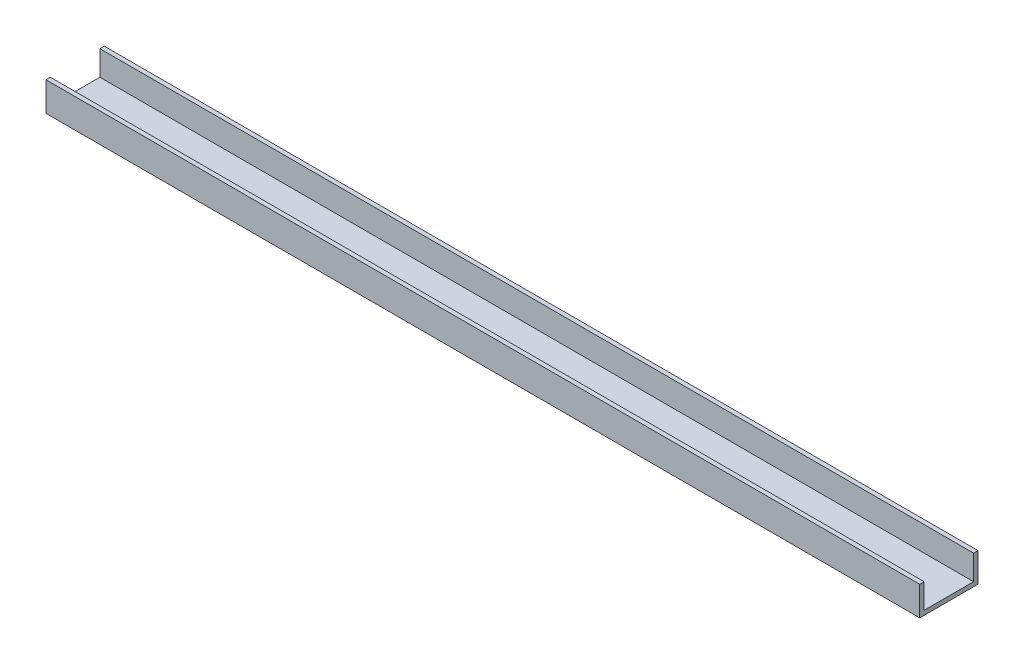
ISO-10303-21;
HEADER;
FILE_DESCRIPTION(('STEP AP214'),'2;1');
FILE_NAME('part.step','',(''),(''),'','','');
FILE_SCHEMA(('AUTOMOTIVE_DESIGN { 1 0 10303 214 1 1 1 1 }'));
ENDSEC;
DATA;
#1=APPLICATION_CONTEXT('core data for automotive mechanical design processes');
#2=APPLICATION_PROTOCOL_DEFINITION('international standard','automotive_design',2000,#1);
#3=PRODUCT_CONTEXT('',#1,'mechanical');
#4=PRODUCT('Part','Part','',(#3));
#5=PRODUCT_RELATED_PRODUCT_CATEGORY('part','',(#4));
#6=PRODUCT_DEFINITION_FORMATION('','',#4);
#7=PRODUCT_DEFINITION_CONTEXT('part definition',#1,'design');
#8=PRODUCT_DEFINITION('design','',#6,#7);
#9=PRODUCT_DEFINITION_SHAPE('','',#8);
#10=(LENGTH_UNIT() NAMED_UNIT(*) SI_UNIT(.MILLI.,.METRE.));
#11=(NAMED_UNIT(*) PLANE_ANGLE_UNIT() SI_UNIT($,.RADIAN.));
#12=(NAMED_UNIT(*) SI_UNIT($,.STERADIAN.) SOLID_ANGLE_UNIT());
#13=UNCERTAINTY_MEASURE_WITH_UNIT(LENGTH_MEASURE(1.E-05),#10,'distance_accuracy_value','');
#14=(GEOMETRIC_REPRESENTATION_CONTEXT(3) GLOBAL_UNCERTAINTY_ASSIGNED_CONTEXT((#13)) GLOBAL_UNIT_ASSIGNED_CONTEXT((#10,
#11,#12)) REPRESENTATION_CONTEXT('',''));
#15=CARTESIAN_POINT('',(0.,0.,0.));
#16=DIRECTION('',(0.,0.,1.));
#17=DIRECTION('',(1.,0.,0.));
#18=AXIS2_PLACEMENT_3D('',#15,#16,#17);
#19=CARTESIAN_POINT('',(300.,-6.42394817570351,-10.));
#20=DIRECTION('',(0.,0.,1.));
#21=DIRECTION('',(0.,-1.,0.));
#22=AXIS2_PLACEMENT_3D('',#19,#20,#21);
#23=PLANE('',#22);
#24=DIRECTION('',(0.,1.,0.));
#25=VECTOR('',#24,1.);
#26=CARTESIAN_POINT('',(0.,-6.42394817570351,-10.));
#27=LINE('',#26,#25);
#28=CARTESIAN_POINT('',(0.,-6.42394817570351,-10.));
#29=VERTEX_POINT('',#28);
#30=CARTESIAN_POINT('',(0.,3.57605182429649,-9.99999999999999));
#31=VERTEX_POINT('',#30);
#32=EDGE_CURVE('E129',#29,#31,#27,.T.);
#33=ORIENTED_EDGE('',*,*,#32,.T.);
#34=DIRECTION('',(-1.,0.,0.));
#35=VECTOR('',#34,1.);
#36=CARTESIAN_POINT('',(300.,3.57605182429649,-9.99999999999999));
#37=LINE('',#36,#35);
#38=CARTESIAN_POINT('',(300.,3.57605182429649,-9.99999999999999));
#39=VERTEX_POINT('',#38);
#40=EDGE_CURVE('E11',#39,#31,#37,.T.);
#41=ORIENTED_EDGE('',*,*,#40,.F.);
#42=DIRECTION('',(0.,1.,0.));
#43=VECTOR('',#42,1.);
#44=CARTESIAN_POINT('',(300.,-6.42394817570351,-10.));
#45=LINE('',#44,#43);
#46=CARTESIAN_POINT('',(300.,-6.42394817570351,-10.));
#47=VERTEX_POINT('',#46);
#48=EDGE_CURVE('E143',#47,#39,#45,.T.);
#49=ORIENTED_EDGE('',*,*,#48,.F.);
#50=DIRECTION('',(-1.,0.,0.));
#51=VECTOR('',#50,1.);
#52=CARTESIAN_POINT('',(300.,-6.42394817570351,-10.));
#53=LINE('',#52,#51);
#54=EDGE_CURVE('E125',#47,#29,#53,.T.);
#55=ORIENTED_EDGE('',*,*,#54,.T.);
#56=EDGE_LOOP('',(#33,#41,#49,#55));
#57=FACE_BOUND('',#56,.T.);
#58=ADVANCED_FACE('F33',(#57),#23,.F.);
#59=CARTESIAN_POINT('',(300.,3.57605182429649,-9.99999999999999));
#60=DIRECTION('',(0.,-1.,0.));
#61=DIRECTION('',(0.,0.,-1.));
#62=AXIS2_PLACEMENT_3D('',#59,#60,#61);
#63=PLANE('',#62);
#64=DIRECTION('',(0.,0.,1.));
#65=VECTOR('',#64,1.);
#66=CARTESIAN_POINT('',(0.,3.57605182429649,-9.99999999999999));
#67=LINE('',#66,#65);
#68=CARTESIAN_POINT('',(0.,3.57605182429649,-8.5));
#69=VERTEX_POINT('',#68);
#70=EDGE_CURVE('E132',#31,#69,#67,.T.);
#71=ORIENTED_EDGE('',*,*,#70,.T.);
#72=DIRECTION('',(-1.,0.,0.));
#73=VECTOR('',#72,1.);
#74=CARTESIAN_POINT('',(300.,3.57605182429649,-8.5));
#75=LINE('',#74,#73);
#76=CARTESIAN_POINT('',(300.,3.57605182429649,-8.5));
#77=VERTEX_POINT('',#76);
#78=EDGE_CURVE('E41',#77,#69,#75,.T.);
#79=ORIENTED_EDGE('',*,*,#78,.F.);
#80=DIRECTION('',(0.,0.,1.));
#81=VECTOR('',#80,1.);
#82=CARTESIAN_POINT('',(300.,3.57605182429649,-9.99999999999999));
#83=LINE('',#82,#81);
#84=EDGE_CURVE('E92',#39,#77,#83,.T.);
#85=ORIENTED_EDGE('',*,*,#84,.F.);
#86=ORIENTED_EDGE('',*,*,#40,.T.);
#87=EDGE_LOOP('',(#71,#79,#85,#86));
#88=FACE_BOUND('',#87,.T.);
#89=ADVANCED_FACE('F178',(#88),#63,.F.);
#90=CARTESIAN_POINT('',(300.,3.57605182429649,-8.5));
#91=DIRECTION('',(0.,0.,-1.));
#92=DIRECTION('',(-1.,0.,0.));
#93=AXIS2_PLACEMENT_3D('',#90,#91,#92);
#94=PLANE('',#93);
#95=DIRECTION('',(0.,-1.,0.));
#96=VECTOR('',#95,1.);
#97=CARTESIAN_POINT('',(0.,3.57605182429649,-8.5));
#98=LINE('',#97,#96);
#99=CARTESIAN_POINT('',(0.,-4.92394817570351,-8.5));
#100=VERTEX_POINT('',#99);
#101=EDGE_CURVE('E134',#69,#100,#98,.T.);
#102=ORIENTED_EDGE('',*,*,#101,.T.);
#103=DIRECTION('',(-1.,0.,0.));
#104=VECTOR('',#103,1.);
#105=CARTESIAN_POINT('',(300.,-4.92394817570351,-8.5));
#106=LINE('',#105,#104);
#107=CARTESIAN_POINT('',(300.,-4.92394817570351,-8.5));
#108=VERTEX_POINT('',#107);
#109=EDGE_CURVE('E150',#108,#100,#106,.T.);
#110=ORIENTED_EDGE('',*,*,#109,.F.);
#111=DIRECTION('',(0.,-1.,0.));
#112=VECTOR('',#111,1.);
#113=CARTESIAN_POINT('',(300.,3.57605182429649,-8.5));
#114=LINE('',#113,#112);
#115=EDGE_CURVE('E158',#77,#108,#114,.T.);
#116=ORIENTED_EDGE('',*,*,#115,.F.);
#117=ORIENTED_EDGE('',*,*,#78,.T.);
#118=EDGE_LOOP('',(#102,#110,#116,#117));
#119=FACE_BOUND('',#118,.T.);
#120=ADVANCED_FACE('F156',(#119),#94,.F.);
#121=CARTESIAN_POINT('',(300.,-4.92394817570351,-8.5));
#122=DIRECTION('',(0.,-1.,0.));
#123=DIRECTION('',(0.,0.,-1.));
#124=AXIS2_PLACEMENT_3D('',#121,#122,#123);
#125=PLANE('',#124);
#126=DIRECTION('',(0.,0.,1.));
#127=VECTOR('',#126,1.);
#128=CARTESIAN_POINT('',(0.,-4.92394817570351,-8.5));
#129=LINE('',#128,#127);
#130=CARTESIAN_POINT('',(0.,-4.92394817570351,8.5));
#131=VERTEX_POINT('',#130);
#132=EDGE_CURVE('E136',#100,#131,#129,.T.);
#133=ORIENTED_EDGE('',*,*,#132,.T.);
#134=DIRECTION('',(-1.,0.,0.));
#135=VECTOR('',#134,1.);
#136=CARTESIAN_POINT('',(300.,-4.92394817570351,8.5));
#137=LINE('',#136,#135);
#138=CARTESIAN_POINT('',(300.,-4.92394817570351,8.5));
#139=VERTEX_POINT('',#138);
#140=EDGE_CURVE('E147',#139,#131,#137,.T.);
#141=ORIENTED_EDGE('',*,*,#140,.F.);
#142=DIRECTION('',(0.,0.,1.));
#143=VECTOR('',#142,1.);
#144=CARTESIAN_POINT('',(300.,-4.92394817570351,-8.5));
#145=LINE('',#144,#143);
#146=EDGE_CURVE('E170',#108,#139,#145,.T.);
#147=ORIENTED_EDGE('',*,*,#146,.F.);
#148=ORIENTED_EDGE('',*,*,#109,.T.);
#149=EDGE_LOOP('',(#133,#141,#147,#148));
#150=FACE_BOUND('',#149,.T.);
#151=ADVANCED_FACE('F166',(#150),#125,.F.);
#152=CARTESIAN_POINT('',(300.,-4.92394817570351,8.5));
#153=DIRECTION('',(0.,0.,1.));
#154=DIRECTION('',(0.,-1.,0.));
#155=AXIS2_PLACEMENT_3D('',#152,#153,#154);
#156=PLANE('',#155);
#157=DIRECTION('',(0.,1.,0.));
#158=VECTOR('',#157,1.);
#159=CARTESIAN_POINT('',(0.,-4.92394817570351,8.5));
#160=LINE('',#159,#158);
#161=CARTESIAN_POINT('',(0.,3.57605182429649,8.49999999999999));
#162=VERTEX_POINT('',#161);
#163=EDGE_CURVE('E138',#131,#162,#160,.T.);
#164=ORIENTED_EDGE('',*,*,#163,.T.);
#165=DIRECTION('',(-1.,0.,0.));
#166=VECTOR('',#165,1.);
#167=CARTESIAN_POINT('',(300.,3.57605182429649,8.49999999999999));
#168=LINE('',#167,#166);
#169=CARTESIAN_POINT('',(300.,3.57605182429649,8.49999999999999));
#170=VERTEX_POINT('',#169);
#171=EDGE_CURVE('E120',#170,#162,#168,.T.);
#172=ORIENTED_EDGE('',*,*,#171,.F.);
#173=DIRECTION('',(0.,1.,0.));
#174=VECTOR('',#173,1.);
#175=CARTESIAN_POINT('',(300.,-4.92394817570351,8.5));
#176=LINE('',#175,#174);
#177=EDGE_CURVE('E111',#139,#170,#176,.T.);
#178=ORIENTED_EDGE('',*,*,#177,.F.);
#179=ORIENTED_EDGE('',*,*,#140,.T.);
#180=EDGE_LOOP('',(#164,#172,#178,#179));
#181=FACE_BOUND('',#180,.T.);
#182=ADVANCED_FACE('F169',(#181),#156,.F.);
#183=CARTESIAN_POINT('',(300.,3.57605182429649,8.49999999999999));
#184=DIRECTION('',(0.,-1.,0.));
#185=DIRECTION('',(0.,0.,-1.));
#186=AXIS2_PLACEMENT_3D('',#183,#184,#185);
#187=PLANE('',#186);
#188=DIRECTION('',(0.,0.,1.));
#189=VECTOR('',#188,1.);
#190=CARTESIAN_POINT('',(0.,3.57605182429649,8.49999999999999));
#191=LINE('',#190,#189);
#192=CARTESIAN_POINT('',(0.,3.57605182429649,9.99999999999999));
#193=VERTEX_POINT('',#192);
#194=EDGE_CURVE('E119',#162,#193,#191,.T.);
#195=ORIENTED_EDGE('',*,*,#194,.T.);
#196=DIRECTION('',(-1.,0.,0.));
#197=VECTOR('',#196,1.);
#198=CARTESIAN_POINT('',(300.,3.57605182429649,9.99999999999999));
#199=LINE('',#198,#197);
#200=CARTESIAN_POINT('',(300.,3.57605182429649,9.99999999999999));
#201=VERTEX_POINT('',#200);
#202=EDGE_CURVE('E116',#201,#193,#199,.T.);
#203=ORIENTED_EDGE('',*,*,#202,.F.);
#204=DIRECTION('',(0.,0.,1.));
#205=VECTOR('',#204,1.);
#206=CARTESIAN_POINT('',(300.,3.57605182429649,8.49999999999999));
#207=LINE('',#206,#205);
#208=EDGE_CURVE('E105',#170,#201,#207,.T.);
#209=ORIENTED_EDGE('',*,*,#208,.F.);
#210=ORIENTED_EDGE('',*,*,#171,.T.);
#211=EDGE_LOOP('',(#195,#203,#209,#210));
#212=FACE_BOUND('',#211,.T.);
#213=ADVANCED_FACE('F117',(#212),#187,.F.);
#214=CARTESIAN_POINT('',(300.,3.57605182429649,9.99999999999999));
#215=DIRECTION('',(0.,0.,-1.));
#216=DIRECTION('',(0.,1.,0.));
#217=AXIS2_PLACEMENT_3D('',#214,#215,#216);
#218=PLANE('',#217);
#219=DIRECTION('',(0.,-1.,0.));
#220=VECTOR('',#219,1.);
#221=CARTESIAN_POINT('',(0.,3.57605182429649,9.99999999999999));
#222=LINE('',#221,#220);
#223=CARTESIAN_POINT('',(0.,-6.42394817570351,10.));
#224=VERTEX_POINT('',#223);
#225=EDGE_CURVE('E78',#193,#224,#222,.T.);
#226=ORIENTED_EDGE('',*,*,#225,.T.);
#227=DIRECTION('',(-1.,0.,0.));
#228=VECTOR('',#227,1.);
#229=CARTESIAN_POINT('',(300.,-6.42394817570351,10.));
#230=LINE('',#229,#228);
#231=CARTESIAN_POINT('',(300.,-6.42394817570351,10.));
#232=VERTEX_POINT('',#231);
#233=EDGE_CURVE('E121',#232,#224,#230,.T.);
#234=ORIENTED_EDGE('',*,*,#233,.F.);
#235=DIRECTION('',(0.,-1.,0.));
#236=VECTOR('',#235,1.);
#237=CARTESIAN_POINT('',(300.,3.57605182429649,9.99999999999999));
#238=LINE('',#237,#236);
#239=EDGE_CURVE('E109',#201,#232,#238,.T.);
#240=ORIENTED_EDGE('',*,*,#239,.F.);
#241=ORIENTED_EDGE('',*,*,#202,.T.);
#242=EDGE_LOOP('',(#226,#234,#240,#241));
#243=FACE_BOUND('',#242,.T.);
#244=ADVANCED_FACE('F123',(#243),#218,.F.);
#245=CARTESIAN_POINT('',(300.,-6.42394817570351,10.));
#246=DIRECTION('',(0.,1.,0.));
#247=DIRECTION('',(0.,0.,1.));
#248=AXIS2_PLACEMENT_3D('',#245,#246,#247);
#249=PLANE('',#248);
#250=DIRECTION('',(0.,0.,-1.));
#251=VECTOR('',#250,1.);
#252=CARTESIAN_POINT('',(0.,-6.42394817570351,10.));
#253=LINE('',#252,#251);
#254=EDGE_CURVE('E84',#224,#29,#253,.T.);
#255=ORIENTED_EDGE('',*,*,#254,.T.);
#256=ORIENTED_EDGE('',*,*,#54,.F.);
#257=DIRECTION('',(0.,0.,-1.));
#258=VECTOR('',#257,1.);
#259=CARTESIAN_POINT('',(300.,-6.42394817570351,10.));
#260=LINE('',#259,#258);
#261=EDGE_CURVE('E49',#232,#47,#260,.T.);
#262=ORIENTED_EDGE('',*,*,#261,.F.);
#263=ORIENTED_EDGE('',*,*,#233,.T.);
#264=EDGE_LOOP('',(#255,#256,#262,#263));
#265=FACE_BOUND('',#264,.T.);
#266=ADVANCED_FACE('F194',(#265),#249,.F.);
#267=CARTESIAN_POINT('',(300.,0.,0.));
#268=DIRECTION('',(1.,0.,0.));
#269=DIRECTION('',(0.,0.,-1.));
#270=AXIS2_PLACEMENT_3D('',#267,#268,#269);
#271=PLANE('',#270);
#272=ORIENTED_EDGE('',*,*,#48,.T.);
#273=ORIENTED_EDGE('',*,*,#84,.T.);
#274=ORIENTED_EDGE('',*,*,#115,.T.);
#275=ORIENTED_EDGE('',*,*,#146,.T.);
#276=ORIENTED_EDGE('',*,*,#177,.T.);
#277=ORIENTED_EDGE('',*,*,#208,.T.);
#278=ORIENTED_EDGE('',*,*,#239,.T.);
#279=ORIENTED_EDGE('',*,*,#261,.T.);
#280=EDGE_LOOP('',(#272,#273,#274,#275,#276,#277,#278,#279));
#281=FACE_BOUND('',#280,.T.);
#282=ADVANCED_FACE('F107',(#281),#271,.T.);
#283=CARTESIAN_POINT('',(0.,0.,0.));
#284=DIRECTION('',(1.,0.,0.));
#285=DIRECTION('',(0.,0.,-1.));
#286=AXIS2_PLACEMENT_3D('',#283,#284,#285);
#287=PLANE('',#286);
#288=ORIENTED_EDGE('',*,*,#32,.F.);
#289=ORIENTED_EDGE('',*,*,#254,.F.);
#290=ORIENTED_EDGE('',*,*,#225,.F.);
#291=ORIENTED_EDGE('',*,*,#194,.F.);
#292=ORIENTED_EDGE('',*,*,#163,.F.);
#293=ORIENTED_EDGE('',*,*,#132,.F.);
#294=ORIENTED_EDGE('',*,*,#101,.F.);
#295=ORIENTED_EDGE('',*,*,#70,.F.);
#296=EDGE_LOOP('',(#288,#289,#290,#291,#292,#293,#294,#295));
#297=FACE_BOUND('',#296,.T.);
#298=ADVANCED_FACE('F162',(#297),#287,.F.);
#299=CLOSED_SHELL('',(#58,#89,#120,#151,#182,#213,#244,#266,#282,#298));
#300=MANIFOLD_SOLID_BREP('B2',#299);
#301=ADVANCED_BREP_SHAPE_REPRESENTATION('',(#18,#300),#14);
#302=SHAPE_DEFINITION_REPRESENTATION(#9,#301);
ENDSEC;
END-ISO-10303-21;
